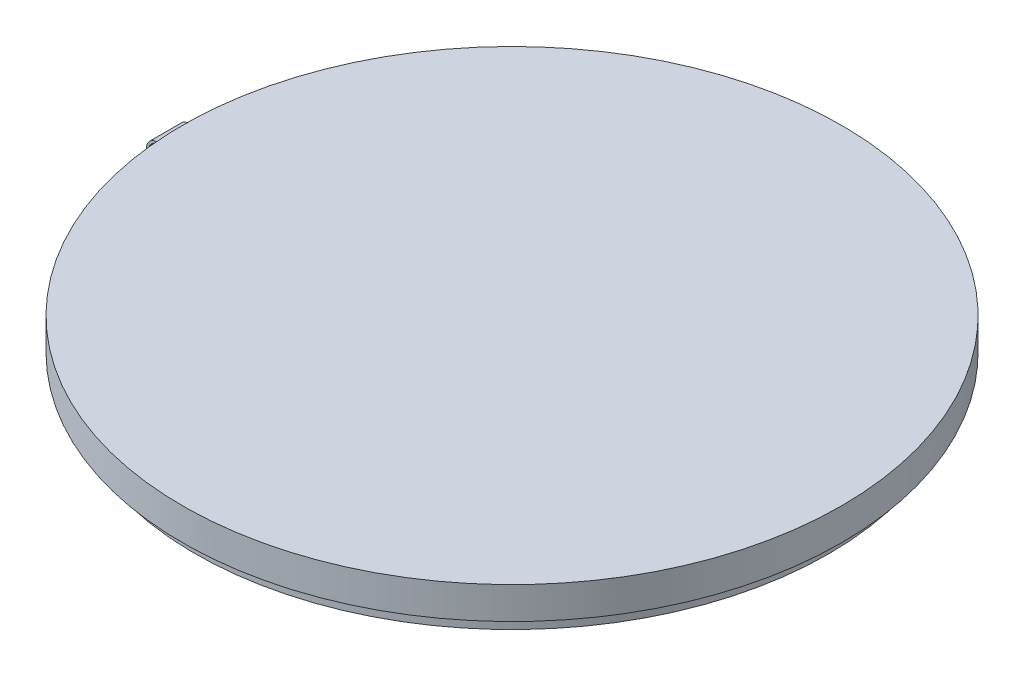
ISO-10303-21;
HEADER;
FILE_DESCRIPTION(('STEP AP214'),'2;1');
FILE_NAME('part.step','',(''),(''),'','','');
FILE_SCHEMA(('AUTOMOTIVE_DESIGN { 1 0 10303 214 1 1 1 1 }'));
ENDSEC;
DATA;
#1=APPLICATION_CONTEXT('core data for automotive mechanical design processes');
#2=APPLICATION_PROTOCOL_DEFINITION('international standard','automotive_design',2000,#1);
#3=PRODUCT_CONTEXT('',#1,'mechanical');
#4=PRODUCT('Part','Part','',(#3));
#5=PRODUCT_RELATED_PRODUCT_CATEGORY('part','',(#4));
#6=PRODUCT_DEFINITION_FORMATION('','',#4);
#7=PRODUCT_DEFINITION_CONTEXT('part definition',#1,'design');
#8=PRODUCT_DEFINITION('design','',#6,#7);
#9=PRODUCT_DEFINITION_SHAPE('','',#8);
#10=(LENGTH_UNIT() NAMED_UNIT(*) SI_UNIT(.MILLI.,.METRE.));
#11=(NAMED_UNIT(*) PLANE_ANGLE_UNIT() SI_UNIT($,.RADIAN.));
#12=(NAMED_UNIT(*) SI_UNIT($,.STERADIAN.) SOLID_ANGLE_UNIT());
#13=UNCERTAINTY_MEASURE_WITH_UNIT(LENGTH_MEASURE(1.E-05),#10,'distance_accuracy_value','');
#14=(GEOMETRIC_REPRESENTATION_CONTEXT(3) GLOBAL_UNCERTAINTY_ASSIGNED_CONTEXT((#13)) GLOBAL_UNIT_ASSIGNED_CONTEXT((#10,
#11,#12)) REPRESENTATION_CONTEXT('',''));
#15=CARTESIAN_POINT('',(0.,0.,0.));
#16=DIRECTION('',(0.,0.,1.));
#17=DIRECTION('',(1.,0.,0.));
#18=AXIS2_PLACEMENT_3D('',#15,#16,#17);
#19=CARTESIAN_POINT('',(3.43024899888577E-12,-1000.,0.));
#20=DIRECTION('',(0.,-1.,0.));
#21=DIRECTION('',(1.,0.,0.));
#22=AXIS2_PLACEMENT_3D('',#19,#20,#21);
#23=CYLINDRICAL_SURFACE('',#22,26.162);
#24=CARTESIAN_POINT('',(0.,2.53999999999999,0.));
#25=DIRECTION('',(0.,-1.,0.));
#26=DIRECTION('',(1.,0.,0.));
#27=AXIS2_PLACEMENT_3D('',#24,#25,#26);
#28=CIRCLE('',#27,26.162);
#29=CARTESIAN_POINT('',(26.162,2.54000000000008,0.));
#30=VERTEX_POINT('',#29);
#31=EDGE_CURVE('E50',#30,#30,#28,.T.);
#32=ORIENTED_EDGE('',*,*,#31,.T.);
#33=EDGE_LOOP('',(#32));
#34=FACE_BOUND('',#33,.T.);
#35=CARTESIAN_POINT('',(0.,1.65099999999985,0.));
#36=DIRECTION('',(0.,-1.,0.));
#37=DIRECTION('',(1.,0.,0.));
#38=AXIS2_PLACEMENT_3D('',#35,#36,#37);
#39=CIRCLE('',#38,26.162);
#40=CARTESIAN_POINT('',(-26.131156576011,1.65099999999985,-1.27));
#41=VERTEX_POINT('',#40);
#42=CARTESIAN_POINT('',(-26.131156576011,1.65099999999985,1.27));
#43=VERTEX_POINT('',#42);
#44=EDGE_CURVE('E11',#41,#43,#39,.F.);
#45=ORIENTED_EDGE('',*,*,#44,.T.);
#46=DIRECTION('',(0.,-1.,0.));
#47=VECTOR('',#46,1.);
#48=CARTESIAN_POINT('',(-26.1311565760075,-1000.,1.27));
#49=LINE('',#48,#47);
#50=CARTESIAN_POINT('',(-26.1311565760109,-2.00764266305087E-13,1.27));
#51=VERTEX_POINT('',#50);
#52=EDGE_CURVE('E89',#43,#51,#49,.T.);
#53=ORIENTED_EDGE('',*,*,#52,.T.);
#54=CARTESIAN_POINT('',(0.,-1.11022302462516E-13,0.));
#55=DIRECTION('',(0.,-1.,0.));
#56=DIRECTION('',(1.,0.,0.));
#57=AXIS2_PLACEMENT_3D('',#54,#55,#56);
#58=CIRCLE('',#57,26.162);
#59=CARTESIAN_POINT('',(-26.1311565760109,-2.00658676147104E-13,-1.27));
#60=VERTEX_POINT('',#59);
#61=EDGE_CURVE('E132',#60,#51,#58,.T.);
#62=ORIENTED_EDGE('',*,*,#61,.F.);
#63=DIRECTION('',(0.,-1.,0.));
#64=VECTOR('',#63,1.);
#65=CARTESIAN_POINT('',(-26.1311565760075,-1000.,-1.27));
#66=LINE('',#65,#64);
#67=EDGE_CURVE('E106',#41,#60,#66,.T.);
#68=ORIENTED_EDGE('',*,*,#67,.F.);
#69=EDGE_LOOP('',(#45,#53,#62,#68));
#70=FACE_BOUND('',#69,.T.);
#71=ADVANCED_FACE('F41',(#34,#70),#23,.T.);
#72=CARTESIAN_POINT('',(24.13,0.,0.));
#73=DIRECTION('',(0.,-1.,0.));
#74=DIRECTION('',(1.,0.,0.));
#75=AXIS2_PLACEMENT_3D('',#72,#73,#74);
#76=PLANE('',#75);
#77=CARTESIAN_POINT('',(0.,-1.11022302462516E-13,0.));
#78=DIRECTION('',(0.,-1.,0.));
#79=DIRECTION('',(1.,0.,0.));
#80=AXIS2_PLACEMENT_3D('',#77,#78,#79);
#81=CIRCLE('',#80,24.13);
#82=CARTESIAN_POINT('',(24.13,0.,0.));
#83=VERTEX_POINT('',#82);
#84=EDGE_CURVE('E116',#83,#83,#81,.T.);
#85=ORIENTED_EDGE('',*,*,#84,.T.);
#86=EDGE_LOOP('',(#85));
#87=FACE_BOUND('',#86,.T.);
#88=ADVANCED_FACE('F43',(#87),#76,.T.);
#89=CARTESIAN_POINT('',(0.,2.53999999999996,0.));
#90=DIRECTION('',(0.,1.,0.));
#91=DIRECTION('',(-1.,0.,0.));
#92=AXIS2_PLACEMENT_3D('',#89,#90,#91);
#93=PLANE('',#92);
#94=ORIENTED_EDGE('',*,*,#31,.F.);
#95=EDGE_LOOP('',(#94));
#96=FACE_BOUND('',#95,.T.);
#97=ADVANCED_FACE('F140',(#96),#93,.T.);
#98=CARTESIAN_POINT('',(26.162,0.,0.));
#99=DIRECTION('',(0.,-1.,0.));
#100=DIRECTION('',(1.,0.,0.));
#101=AXIS2_PLACEMENT_3D('',#98,#99,#100);
#102=PLANE('',#101);
#103=ORIENTED_EDGE('',*,*,#61,.T.);
#104=DIRECTION('',(1.,0.,0.));
#105=VECTOR('',#104,1.);
#106=CARTESIAN_POINT('',(-25.4,-2.00764476771365E-13,1.27));
#107=LINE('',#106,#105);
#108=CARTESIAN_POINT('',(-26.924,-2.00764038082008E-13,1.27));
#109=VERTEX_POINT('',#108);
#110=EDGE_CURVE('E65',#109,#51,#107,.T.);
#111=ORIENTED_EDGE('',*,*,#110,.F.);
#112=DIRECTION('',(0.,0.,-1.));
#113=VECTOR('',#112,1.);
#114=CARTESIAN_POINT('',(-26.924,-2.00764038082008E-13,1.27));
#115=LINE('',#114,#113);
#116=CARTESIAN_POINT('',(-26.924,-2.00764038082008E-13,-1.27));
#117=VERTEX_POINT('',#116);
#118=EDGE_CURVE('E98',#109,#117,#115,.T.);
#119=ORIENTED_EDGE('',*,*,#118,.T.);
#120=DIRECTION('',(1.,0.,0.));
#121=VECTOR('',#120,1.);
#122=CARTESIAN_POINT('',(-25.4,-2.00764476771365E-13,-1.27));
#123=LINE('',#122,#121);
#124=EDGE_CURVE('E57',#117,#60,#123,.T.);
#125=ORIENTED_EDGE('',*,*,#124,.T.);
#126=EDGE_LOOP('',(#103,#111,#119,#125));
#127=FACE_BOUND('',#126,.T.);
#128=CARTESIAN_POINT('',(0.,-1.11022302462516E-13,0.));
#129=DIRECTION('',(0.,-1.,0.));
#130=DIRECTION('',(1.,0.,0.));
#131=AXIS2_PLACEMENT_3D('',#128,#129,#130);
#132=CIRCLE('',#131,25.146);
#133=CARTESIAN_POINT('',(25.146,0.,0.));
#134=VERTEX_POINT('',#133);
#135=EDGE_CURVE('E128',#134,#134,#132,.T.);
#136=ORIENTED_EDGE('',*,*,#135,.F.);
#137=EDGE_LOOP('',(#136));
#138=FACE_BOUND('',#137,.T.);
#139=ADVANCED_FACE('F142',(#127,#138),#102,.T.);
#140=CARTESIAN_POINT('',(3.43024899888577E-12,-1000.,0.));
#141=DIRECTION('',(0.,-1.,0.));
#142=DIRECTION('',(1.,0.,0.));
#143=AXIS2_PLACEMENT_3D('',#140,#141,#142);
#144=CYLINDRICAL_SURFACE('',#143,25.146);
#145=ORIENTED_EDGE('',*,*,#135,.T.);
#146=EDGE_LOOP('',(#145));
#147=FACE_BOUND('',#146,.T.);
#148=CARTESIAN_POINT('',(0.,-1.2700000000001,0.));
#149=DIRECTION('',(0.,-1.,0.));
#150=DIRECTION('',(1.,0.,0.));
#151=AXIS2_PLACEMENT_3D('',#148,#149,#150);
#152=CIRCLE('',#151,25.146);
#153=CARTESIAN_POINT('',(25.146,-1.27000000000002,0.));
#154=VERTEX_POINT('',#153);
#155=EDGE_CURVE('E124',#154,#154,#152,.T.);
#156=ORIENTED_EDGE('',*,*,#155,.F.);
#157=EDGE_LOOP('',(#156));
#158=FACE_BOUND('',#157,.T.);
#159=ADVANCED_FACE('F147',(#147,#158),#144,.T.);
#160=CARTESIAN_POINT('',(25.146,-1.26999999999998,0.));
#161=DIRECTION('',(0.,-1.,0.));
#162=DIRECTION('',(1.,0.,0.));
#163=AXIS2_PLACEMENT_3D('',#160,#161,#162);
#164=PLANE('',#163);
#165=ORIENTED_EDGE('',*,*,#155,.T.);
#166=EDGE_LOOP('',(#165));
#167=FACE_BOUND('',#166,.T.);
#168=CARTESIAN_POINT('',(0.,-1.2700000000001,0.));
#169=DIRECTION('',(0.,-1.,0.));
#170=DIRECTION('',(1.,0.,0.));
#171=AXIS2_PLACEMENT_3D('',#168,#169,#170);
#172=CIRCLE('',#171,24.13);
#173=CARTESIAN_POINT('',(24.13,-1.27000000000002,0.));
#174=VERTEX_POINT('',#173);
#175=EDGE_CURVE('E120',#174,#174,#172,.T.);
#176=ORIENTED_EDGE('',*,*,#175,.F.);
#177=EDGE_LOOP('',(#176));
#178=FACE_BOUND('',#177,.T.);
#179=ADVANCED_FACE('F157',(#167,#178),#164,.T.);
#180=CARTESIAN_POINT('',(3.43024899888577E-12,-1000.,0.));
#181=DIRECTION('',(0.,-1.,0.));
#182=DIRECTION('',(1.,0.,0.));
#183=AXIS2_PLACEMENT_3D('',#180,#181,#182);
#184=CYLINDRICAL_SURFACE('',#183,24.13);
#185=ORIENTED_EDGE('',*,*,#175,.T.);
#186=EDGE_LOOP('',(#185));
#187=FACE_BOUND('',#186,.T.);
#188=ORIENTED_EDGE('',*,*,#84,.F.);
#189=EDGE_LOOP('',(#188));
#190=FACE_BOUND('',#189,.T.);
#191=ADVANCED_FACE('F161',(#187,#190),#184,.F.);
#192=CARTESIAN_POINT('',(-26.924,0.825499999999799,1.27));
#193=DIRECTION('',(0.,0.,-1.));
#194=DIRECTION('',(-1.,0.,0.));
#195=AXIS2_PLACEMENT_3D('',#192,#193,#194);
#196=PLANE('',#195);
#197=ORIENTED_EDGE('',*,*,#52,.F.);
#198=DIRECTION('',(-1.,0.,0.));
#199=VECTOR('',#198,1.);
#200=CARTESIAN_POINT('',(-26.924,1.6509999999998,1.27));
#201=LINE('',#200,#199);
#202=CARTESIAN_POINT('',(-26.924,1.6509999999998,1.27));
#203=VERTEX_POINT('',#202);
#204=EDGE_CURVE('E83',#43,#203,#201,.T.);
#205=ORIENTED_EDGE('',*,*,#204,.T.);
#206=CARTESIAN_POINT('',(-26.924,0.825499999999799,1.27));
#207=DIRECTION('',(0.,0.,1.));
#208=DIRECTION('',(-1.,0.,0.));
#209=AXIS2_PLACEMENT_3D('',#206,#207,#208);
#210=CIRCLE('',#209,0.8255);
#211=EDGE_CURVE('E87',#203,#109,#210,.T.);
#212=ORIENTED_EDGE('',*,*,#211,.T.);
#213=ORIENTED_EDGE('',*,*,#110,.T.);
#214=EDGE_LOOP('',(#197,#205,#212,#213));
#215=FACE_BOUND('',#214,.T.);
#216=CARTESIAN_POINT('',(-26.924,0.825499999999799,1.27));
#217=DIRECTION('',(0.,0.,1.));
#218=DIRECTION('',(1.,0.,0.));
#219=AXIS2_PLACEMENT_3D('',#216,#217,#218);
#220=CIRCLE('',#219,0.634999999999999);
#221=CARTESIAN_POINT('',(-26.289,0.825499999999799,1.27));
#222=VERTEX_POINT('',#221);
#223=EDGE_CURVE('E184',#222,#222,#220,.T.);
#224=ORIENTED_EDGE('',*,*,#223,.F.);
#225=EDGE_LOOP('',(#224));
#226=FACE_BOUND('',#225,.T.);
#227=ADVANCED_FACE('F85',(#215,#226),#196,.F.);
#228=CARTESIAN_POINT('',(-26.924,0.825499999999799,-1.27));
#229=DIRECTION('',(0.,0.,-1.));
#230=DIRECTION('',(-1.,0.,0.));
#231=AXIS2_PLACEMENT_3D('',#228,#229,#230);
#232=PLANE('',#231);
#233=DIRECTION('',(-1.,0.,0.));
#234=VECTOR('',#233,1.);
#235=CARTESIAN_POINT('',(-26.924,1.6509999999998,-1.27));
#236=LINE('',#235,#234);
#237=CARTESIAN_POINT('',(-26.924,1.6509999999998,-1.27));
#238=VERTEX_POINT('',#237);
#239=EDGE_CURVE('E103',#41,#238,#236,.T.);
#240=ORIENTED_EDGE('',*,*,#239,.F.);
#241=ORIENTED_EDGE('',*,*,#67,.T.);
#242=ORIENTED_EDGE('',*,*,#124,.F.);
#243=CARTESIAN_POINT('',(-26.924,0.825499999999799,-1.27));
#244=DIRECTION('',(0.,0.,1.));
#245=DIRECTION('',(-1.,0.,0.));
#246=AXIS2_PLACEMENT_3D('',#243,#244,#245);
#247=CIRCLE('',#246,0.8255);
#248=EDGE_CURVE('E198',#238,#117,#247,.T.);
#249=ORIENTED_EDGE('',*,*,#248,.F.);
#250=EDGE_LOOP('',(#240,#241,#242,#249));
#251=FACE_BOUND('',#250,.T.);
#252=CARTESIAN_POINT('',(-26.924,0.825499999999799,-1.27));
#253=DIRECTION('',(0.,0.,1.));
#254=DIRECTION('',(1.,0.,0.));
#255=AXIS2_PLACEMENT_3D('',#252,#253,#254);
#256=CIRCLE('',#255,0.634999999999999);
#257=CARTESIAN_POINT('',(-26.289,0.825499999999799,-1.27));
#258=VERTEX_POINT('',#257);
#259=EDGE_CURVE('E187',#258,#258,#256,.T.);
#260=ORIENTED_EDGE('',*,*,#259,.T.);
#261=EDGE_LOOP('',(#260));
#262=FACE_BOUND('',#261,.T.);
#263=ADVANCED_FACE('F168',(#251,#262),#232,.T.);
#264=CARTESIAN_POINT('',(-26.924,1.6509999999998,1.27));
#265=DIRECTION('',(0.,-1.,0.));
#266=DIRECTION('',(1.,0.,0.));
#267=AXIS2_PLACEMENT_3D('',#264,#265,#266);
#268=PLANE('',#267);
#269=ORIENTED_EDGE('',*,*,#44,.F.);
#270=ORIENTED_EDGE('',*,*,#239,.T.);
#271=DIRECTION('',(0.,0.,-1.));
#272=VECTOR('',#271,1.);
#273=CARTESIAN_POINT('',(-26.924,1.6509999999998,1.27));
#274=LINE('',#273,#272);
#275=EDGE_CURVE('E97',#203,#238,#274,.T.);
#276=ORIENTED_EDGE('',*,*,#275,.F.);
#277=ORIENTED_EDGE('',*,*,#204,.F.);
#278=EDGE_LOOP('',(#269,#270,#276,#277));
#279=FACE_BOUND('',#278,.T.);
#280=ADVANCED_FACE('F101',(#279),#268,.F.);
#281=CARTESIAN_POINT('',(-26.924,0.825499999999799,1.27));
#282=DIRECTION('',(0.,0.,-1.));
#283=DIRECTION('',(-1.,0.,0.));
#284=AXIS2_PLACEMENT_3D('',#281,#282,#283);
#285=CYLINDRICAL_SURFACE('',#284,0.8255);
#286=ORIENTED_EDGE('',*,*,#248,.T.);
#287=ORIENTED_EDGE('',*,*,#118,.F.);
#288=ORIENTED_EDGE('',*,*,#211,.F.);
#289=ORIENTED_EDGE('',*,*,#275,.T.);
#290=EDGE_LOOP('',(#286,#287,#288,#289));
#291=FACE_BOUND('',#290,.T.);
#292=ADVANCED_FACE('F96',(#291),#285,.T.);
#293=CARTESIAN_POINT('',(-26.924,0.825499999999799,1.27));
#294=DIRECTION('',(0.,0.,-1.));
#295=DIRECTION('',(-1.,0.,0.));
#296=AXIS2_PLACEMENT_3D('',#293,#294,#295);
#297=CYLINDRICAL_SURFACE('',#296,0.634999999999999);
#298=ORIENTED_EDGE('',*,*,#223,.T.);
#299=EDGE_LOOP('',(#298));
#300=FACE_BOUND('',#299,.T.);
#301=ORIENTED_EDGE('',*,*,#259,.F.);
#302=EDGE_LOOP('',(#301));
#303=FACE_BOUND('',#302,.T.);
#304=ADVANCED_FACE('F171',(#300,#303),#297,.F.);
#305=CLOSED_SHELL('',(#71,#88,#97,#139,#159,#179,#191,#227,#263,#280,#292,#304));
#306=MANIFOLD_SOLID_BREP('B2',#305);
#307=ADVANCED_BREP_SHAPE_REPRESENTATION('',(#18,#306),#14);
#308=SHAPE_DEFINITION_REPRESENTATION(#9,#307);
ENDSEC;
END-ISO-10303-21;
